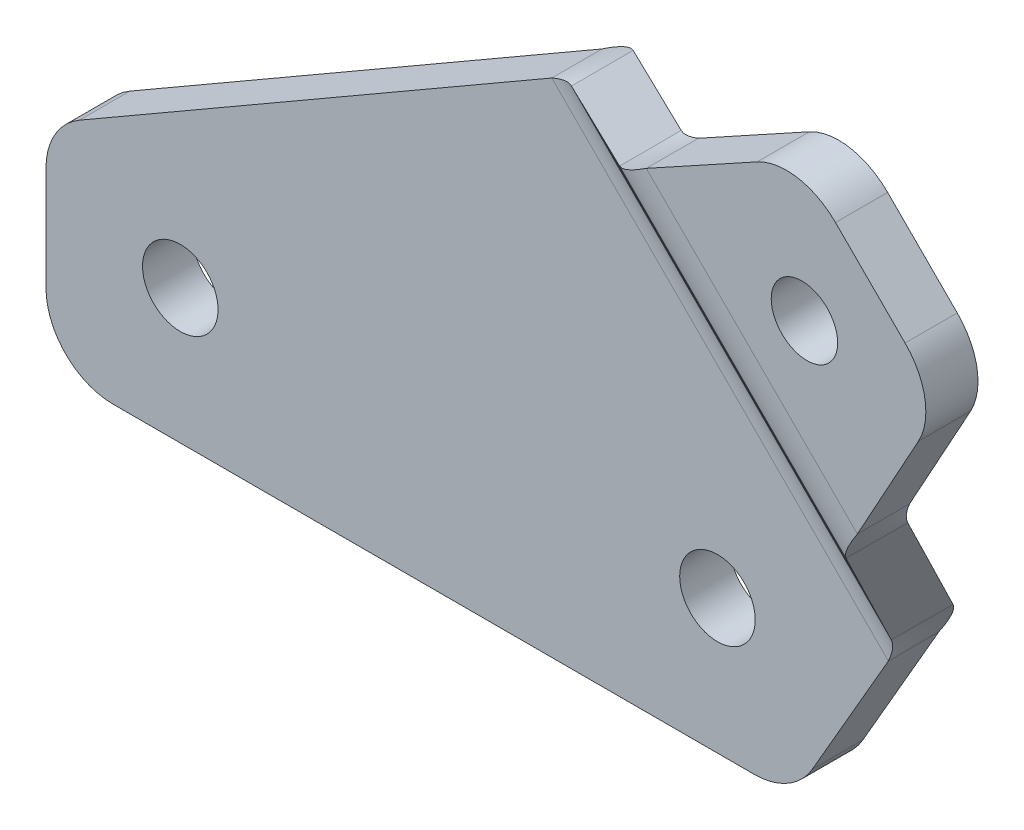
ISO-10303-21;
HEADER;
FILE_DESCRIPTION(('STEP AP214'),'2;1');
FILE_NAME('part.step','',(''),(''),'','','');
FILE_SCHEMA(('AUTOMOTIVE_DESIGN { 1 0 10303 214 1 1 1 1 }'));
ENDSEC;
DATA;
#1=APPLICATION_CONTEXT('core data for automotive mechanical design processes');
#2=APPLICATION_PROTOCOL_DEFINITION('international standard','automotive_design',2000,#1);
#3=PRODUCT_CONTEXT('',#1,'mechanical');
#4=PRODUCT('Part','Part','',(#3));
#5=PRODUCT_RELATED_PRODUCT_CATEGORY('part','',(#4));
#6=PRODUCT_DEFINITION_FORMATION('','',#4);
#7=PRODUCT_DEFINITION_CONTEXT('part definition',#1,'design');
#8=PRODUCT_DEFINITION('design','',#6,#7);
#9=PRODUCT_DEFINITION_SHAPE('','',#8);
#10=(LENGTH_UNIT() NAMED_UNIT(*) SI_UNIT(.MILLI.,.METRE.));
#11=(NAMED_UNIT(*) PLANE_ANGLE_UNIT() SI_UNIT($,.RADIAN.));
#12=(NAMED_UNIT(*) SI_UNIT($,.STERADIAN.) SOLID_ANGLE_UNIT());
#13=UNCERTAINTY_MEASURE_WITH_UNIT(LENGTH_MEASURE(1.E-05),#10,'distance_accuracy_value','');
#14=(GEOMETRIC_REPRESENTATION_CONTEXT(3) GLOBAL_UNCERTAINTY_ASSIGNED_CONTEXT((#13)) GLOBAL_UNIT_ASSIGNED_CONTEXT((#10,
#11,#12)) REPRESENTATION_CONTEXT('',''));
#15=CARTESIAN_POINT('',(0.,0.,0.));
#16=DIRECTION('',(0.,0.,1.));
#17=DIRECTION('',(1.,0.,0.));
#18=AXIS2_PLACEMENT_3D('',#15,#16,#17);
#19=CARTESIAN_POINT('',(-64.29375,16.1775757906459,4.7625));
#20=DIRECTION('',(0.,0.,1.));
#21=DIRECTION('',(1.,0.,0.));
#22=AXIS2_PLACEMENT_3D('',#19,#20,#21);
#23=CYLINDRICAL_SURFACE('',#22,6.35);
#24=DIRECTION('',(0.,0.,1.));
#25=VECTOR('',#24,1.);
#26=CARTESIAN_POINT('',(-67.46875,21.676837104677,4.7625));
#27=LINE('',#26,#25);
#28=CARTESIAN_POINT('',(-67.46875,21.676837104677,0.));
#29=VERTEX_POINT('',#28);
#30=CARTESIAN_POINT('',(-67.46875,21.676837104677,4.7625));
#31=VERTEX_POINT('',#30);
#32=EDGE_CURVE('E425',#29,#31,#27,.T.);
#33=ORIENTED_EDGE('',*,*,#32,.F.);
#34=CARTESIAN_POINT('',(-64.29375,16.1775757906459,0.));
#35=DIRECTION('',(0.,0.,-1.));
#36=DIRECTION('',(-1.,0.,0.));
#37=AXIS2_PLACEMENT_3D('',#34,#35,#36);
#38=CIRCLE('',#37,6.35);
#39=CARTESIAN_POINT('',(-70.64375,16.1775757906459,0.));
#40=VERTEX_POINT('',#39);
#41=EDGE_CURVE('E246',#40,#29,#38,.T.);
#42=ORIENTED_EDGE('',*,*,#41,.F.);
#43=DIRECTION('',(0.,0.,1.));
#44=VECTOR('',#43,1.);
#45=CARTESIAN_POINT('',(-70.64375,16.1775757906459,4.7625));
#46=LINE('',#45,#44);
#47=CARTESIAN_POINT('',(-70.64375,16.1775757906459,4.7625));
#48=VERTEX_POINT('',#47);
#49=EDGE_CURVE('E421',#40,#48,#46,.T.);
#50=ORIENTED_EDGE('',*,*,#49,.T.);
#51=CARTESIAN_POINT('',(-64.29375,16.1775757906459,4.7625));
#52=DIRECTION('',(0.,0.,-1.));
#53=DIRECTION('',(-0.866025403784439,0.5,0.));
#54=AXIS2_PLACEMENT_3D('',#51,#52,#53);
#55=CIRCLE('',#54,6.35);
#56=EDGE_CURVE('E194',#48,#31,#55,.T.);
#57=ORIENTED_EDGE('',*,*,#56,.T.);
#58=EDGE_LOOP('',(#33,#42,#50,#57));
#59=FACE_BOUND('',#58,.T.);
#60=ADVANCED_FACE('F50',(#59),#23,.T.);
#61=CARTESIAN_POINT('',(-70.64375,19.84375,4.7625));
#62=DIRECTION('',(1.,0.,0.));
#63=DIRECTION('',(0.,1.,0.));
#64=AXIS2_PLACEMENT_3D('',#61,#62,#63);
#65=PLANE('',#64);
#66=ORIENTED_EDGE('',*,*,#49,.F.);
#67=DIRECTION('',(0.,1.,0.));
#68=VECTOR('',#67,1.);
#69=CARTESIAN_POINT('',(-70.64375,36.272010063895,0.));
#70=LINE('',#69,#68);
#71=CARTESIAN_POINT('',(-70.64375,6.35,0.));
#72=VERTEX_POINT('',#71);
#73=EDGE_CURVE('E242',#72,#40,#70,.T.);
#74=ORIENTED_EDGE('',*,*,#73,.F.);
#75=DIRECTION('',(0.,0.,1.));
#76=VECTOR('',#75,1.);
#77=CARTESIAN_POINT('',(-70.64375,6.35,4.7625));
#78=LINE('',#77,#76);
#79=CARTESIAN_POINT('',(-70.64375,6.35,4.7625));
#80=VERTEX_POINT('',#79);
#81=EDGE_CURVE('E417',#72,#80,#78,.T.);
#82=ORIENTED_EDGE('',*,*,#81,.T.);
#83=DIRECTION('',(0.,1.,0.));
#84=VECTOR('',#83,1.);
#85=CARTESIAN_POINT('',(-70.64375,19.84375,4.7625));
#86=LINE('',#85,#84);
#87=EDGE_CURVE('E198',#80,#48,#86,.T.);
#88=ORIENTED_EDGE('',*,*,#87,.T.);
#89=EDGE_LOOP('',(#66,#74,#82,#88));
#90=FACE_BOUND('',#89,.T.);
#91=ADVANCED_FACE('F726',(#90),#65,.F.);
#92=CARTESIAN_POINT('',(-64.29375,6.35,4.7625));
#93=DIRECTION('',(0.,0.,1.));
#94=DIRECTION('',(1.,0.,0.));
#95=AXIS2_PLACEMENT_3D('',#92,#93,#94);
#96=CYLINDRICAL_SURFACE('',#95,6.35);
#97=ORIENTED_EDGE('',*,*,#81,.F.);
#98=CARTESIAN_POINT('',(-64.29375,6.35,0.));
#99=DIRECTION('',(0.,0.,-1.));
#100=DIRECTION('',(-1.,0.,0.));
#101=AXIS2_PLACEMENT_3D('',#98,#99,#100);
#102=CIRCLE('',#101,6.35);
#103=CARTESIAN_POINT('',(-64.29375,0.,0.));
#104=VERTEX_POINT('',#103);
#105=EDGE_CURVE('E238',#104,#72,#102,.T.);
#106=ORIENTED_EDGE('',*,*,#105,.F.);
#107=DIRECTION('',(0.,0.,1.));
#108=VECTOR('',#107,1.);
#109=CARTESIAN_POINT('',(-64.29375,0.,4.7625));
#110=LINE('',#109,#108);
#111=CARTESIAN_POINT('',(-64.29375,0.,4.7625));
#112=VERTEX_POINT('',#111);
#113=EDGE_CURVE('E413',#104,#112,#110,.T.);
#114=ORIENTED_EDGE('',*,*,#113,.T.);
#115=CARTESIAN_POINT('',(-64.29375,6.35,4.7625));
#116=DIRECTION('',(0.,0.,-1.));
#117=DIRECTION('',(-0.707106781186547,-0.707106781186548,0.));
#118=AXIS2_PLACEMENT_3D('',#115,#116,#117);
#119=CIRCLE('',#118,6.35);
#120=EDGE_CURVE('E202',#112,#80,#119,.T.);
#121=ORIENTED_EDGE('',*,*,#120,.T.);
#122=EDGE_LOOP('',(#97,#106,#114,#121));
#123=FACE_BOUND('',#122,.T.);
#124=ADVANCED_FACE('F732',(#123),#96,.T.);
#125=CARTESIAN_POINT('',(-70.64375,0.,4.7625));
#126=DIRECTION('',(0.,1.,0.));
#127=DIRECTION('',(-1.,0.,0.));
#128=AXIS2_PLACEMENT_3D('',#125,#126,#127);
#129=PLANE('',#128);
#130=ORIENTED_EDGE('',*,*,#113,.F.);
#131=DIRECTION('',(1.,0.,0.));
#132=VECTOR('',#131,1.);
#133=CARTESIAN_POINT('',(-18.2687851922297,0.,0.));
#134=LINE('',#133,#132);
#135=CARTESIAN_POINT('',(-3.66617420935411,0.,0.));
#136=VERTEX_POINT('',#135);
#137=EDGE_CURVE('E234',#136,#104,#134,.F.);
#138=ORIENTED_EDGE('',*,*,#137,.F.);
#139=DIRECTION('',(0.,0.,1.));
#140=VECTOR('',#139,1.);
#141=CARTESIAN_POINT('',(-3.66617420935411,0.,4.7625));
#142=LINE('',#141,#140);
#143=CARTESIAN_POINT('',(-3.66617420935411,0.,4.7625));
#144=VERTEX_POINT('',#143);
#145=EDGE_CURVE('E409',#136,#144,#142,.T.);
#146=ORIENTED_EDGE('',*,*,#145,.T.);
#147=DIRECTION('',(-1.,0.,0.));
#148=VECTOR('',#147,1.);
#149=CARTESIAN_POINT('',(-70.64375,0.,4.7625));
#150=LINE('',#149,#148);
#151=EDGE_CURVE('E206',#144,#112,#150,.T.);
#152=ORIENTED_EDGE('',*,*,#151,.T.);
#153=EDGE_LOOP('',(#130,#138,#146,#152));
#154=FACE_BOUND('',#153,.T.);
#155=ADVANCED_FACE('F1029',(#154),#129,.F.);
#156=CARTESIAN_POINT('',(-3.66617420935414,6.35,4.7625));
#157=DIRECTION('',(0.,0.,1.));
#158=DIRECTION('',(1.,0.,0.));
#159=AXIS2_PLACEMENT_3D('',#156,#157,#158);
#160=CYLINDRICAL_SURFACE('',#159,6.35);
#161=ORIENTED_EDGE('',*,*,#145,.F.);
#162=CARTESIAN_POINT('',(-3.66617420935414,6.35,0.));
#163=DIRECTION('',(0.,0.,-1.));
#164=DIRECTION('',(-1.,0.,0.));
#165=AXIS2_PLACEMENT_3D('',#162,#163,#164);
#166=CIRCLE('',#165,6.35);
#167=CARTESIAN_POINT('',(1.83308710467706,3.175,0.));
#168=VERTEX_POINT('',#167);
#169=EDGE_CURVE('E229',#168,#136,#166,.T.);
#170=ORIENTED_EDGE('',*,*,#169,.F.);
#171=DIRECTION('',(0.,0.,1.));
#172=VECTOR('',#171,1.);
#173=CARTESIAN_POINT('',(1.83308710467706,3.175,4.7625));
#174=LINE('',#173,#172);
#175=CARTESIAN_POINT('',(1.83308710467706,3.175,4.7625));
#176=VERTEX_POINT('',#175);
#177=EDGE_CURVE('E401',#168,#176,#174,.T.);
#178=ORIENTED_EDGE('',*,*,#177,.T.);
#179=CARTESIAN_POINT('',(-3.66617420935414,6.35,4.7625));
#180=DIRECTION('',(0.,0.,-1.));
#181=DIRECTION('',(0.5,-0.866025403784439,0.));
#182=AXIS2_PLACEMENT_3D('',#179,#180,#181);
#183=CIRCLE('',#182,6.35);
#184=EDGE_CURVE('E210',#176,#144,#183,.T.);
#185=ORIENTED_EDGE('',*,*,#184,.T.);
#186=EDGE_LOOP('',(#161,#170,#178,#185));
#187=FACE_BOUND('',#186,.T.);
#188=ADVANCED_FACE('F1018',(#187),#160,.T.);
#189=CARTESIAN_POINT('',(0.,0.,4.7625));
#190=DIRECTION('',(-0.866025403784439,0.5,0.));
#191=DIRECTION('',(-0.5,-0.866025403784439,0.));
#192=AXIS2_PLACEMENT_3D('',#189,#190,#191);
#193=PLANE('',#192);
#194=ORIENTED_EDGE('',*,*,#177,.F.);
#195=DIRECTION('',(-0.5,-0.866025403784439,0.));
#196=VECTOR('',#195,1.);
#197=CARTESIAN_POINT('',(0.,0.,0.));
#198=LINE('',#197,#196);
#199=CARTESIAN_POINT('',(9.02155589780456,15.6257931783202,0.));
#200=VERTEX_POINT('',#199);
#201=EDGE_CURVE('E233',#200,#168,#198,.T.);
#202=ORIENTED_EDGE('',*,*,#201,.F.);
#203=CARTESIAN_POINT('',(9.02155589780457,15.6257931783201,4.7625));
#204=CARTESIAN_POINT('',(9.02155589780453,15.6257931783201,0.));
#205=B_SPLINE_CURVE_WITH_KNOTS('',1,(#203,#204),.UNSPECIFIED.,.F.,.F.,(2,2),(0.,1.),.UNSPECIFIED.);
#206=CARTESIAN_POINT('',(9.02155589780457,15.6257931783202,4.7625));
#207=VERTEX_POINT('',#206);
#208=EDGE_CURVE('E73',#200,#207,#205,.F.);
#209=ORIENTED_EDGE('',*,*,#208,.T.);
#210=DIRECTION('',(-0.5,-0.866025403784439,0.));
#211=VECTOR('',#210,1.);
#212=CARTESIAN_POINT('',(0.,0.,4.7625));
#213=LINE('',#212,#211);
#214=EDGE_CURVE('E214',#207,#176,#213,.T.);
#215=ORIENTED_EDGE('',*,*,#214,.T.);
#216=EDGE_LOOP('',(#194,#202,#209,#215));
#217=FACE_BOUND('',#216,.T.);
#218=ADVANCED_FACE('F348',(#217),#193,.F.);
#219=CARTESIAN_POINT('',(9.02155589780453,15.6257931783201,0.));
#220=CARTESIAN_POINT('',(10.1314115742364,17.2662497758951,0.));
#221=CARTESIAN_POINT('',(11.2297980726473,18.8909220369658,0.607105710027414));
#222=CARTESIAN_POINT('',(12.0909595729148,20.2826844583737,1.72257677814734));
#223=CARTESIAN_POINT('',(9.02155589780457,15.6257931783201,4.7625));
#224=CARTESIAN_POINT('',(9.44376115154303,16.5785084385995,4.7625));
#225=CARTESIAN_POINT('',(9.86150636249929,17.52272124142,5.0661484189342));
#226=CARTESIAN_POINT('',(10.1593858341239,18.3511107195828,5.62378838907368));
#227=B_SPLINE_SURFACE_WITH_KNOTS('',1,3,((#219,#220,#221,#222),(#223,#224,#225,#226)),
.UNSPECIFIED.,.F.,.F.,.F.,(2,2),(4,4),(0.,1.),(0.,0.312434429609136),.UNSPECIFIED.);
#228=CARTESIAN_POINT('',(9.02155589780453,15.6257931783201,0.));
#229=CARTESIAN_POINT('',(10.1314115742364,17.2662497758951,0.));
#230=CARTESIAN_POINT('',(11.2297980726473,18.8909220369658,0.607105710027414));
#231=CARTESIAN_POINT('',(12.0909595729148,20.2826844583737,1.72257677814734));
#232=B_SPLINE_CURVE_WITH_KNOTS('',3,(#228,#229,#230,#231),.UNSPECIFIED.,.F.,.F.,(4,4),(0.,
0.312434429609136),.UNSPECIFIED.);
#233=CARTESIAN_POINT('',(12.0909595729148,20.2826844583737,1.72257677814737));
#234=VERTEX_POINT('',#233);
#235=EDGE_CURVE('E310',#200,#234,#232,.T.);
#236=CARTESIAN_POINT('',(12.0909595729148,20.2826844583737,1.72257677814734));
#237=CARTESIAN_POINT('',(10.1593858341239,18.3511107195828,5.62378838907368));
#238=B_SPLINE_CURVE_WITH_KNOTS('',1,(#236,#237),.UNSPECIFIED.,.F.,.F.,(2,2),(0.,1.),.UNSPECIFIED.);
#239=CARTESIAN_POINT('',(10.1593858341239,18.3511107195828,5.62378838907368));
#240=VERTEX_POINT('',#239);
#241=EDGE_CURVE('E380',#234,#240,#238,.T.);
#242=CARTESIAN_POINT('',(10.1593858341239,18.3511107195828,5.62378838907368));
#243=CARTESIAN_POINT('',(9.86150636249929,17.52272124142,5.0661484189342));
#244=CARTESIAN_POINT('',(9.44376115154303,16.5785084385995,4.7625));
#245=CARTESIAN_POINT('',(9.02155589780457,15.6257931783201,4.7625));
#246=B_SPLINE_CURVE_WITH_KNOTS('',3,(#242,#243,#244,#245),.UNSPECIFIED.,.F.,.F.,(4,4),(0.,
0.312434429609136),.UNSPECIFIED.);
#247=EDGE_CURVE('E329',#207,#240,#246,.F.);
#248=ORIENTED_EDGE('',*,*,#208,.F.);
#249=ORIENTED_EDGE('',*,*,#235,.T.);
#250=ORIENTED_EDGE('',*,*,#241,.T.);
#251=ORIENTED_EDGE('',*,*,#247,.F.);
#252=EDGE_LOOP('',(#248,#249,#250,#251));
#253=FACE_BOUND('',#252,.T.);
#254=ADVANCED_FACE('F335',(#253),#227,.F.);
#255=CARTESIAN_POINT('',(1.73371737524114,1.73371737524114,-6.77556989811773));
#256=DIRECTION('',(-0.832927930778083,0.533097473006356,-0.148452505549684));
#257=DIRECTION('',(-0.37647854913814,-0.742503952922578,-0.554032293222323));
#258=AXIS2_PLACEMENT_3D('',#255,#256,#257);
#259=PLANE('',#258);
#260=ORIENTED_EDGE('',*,*,#241,.F.);
#261=DIRECTION('',(-0.37647854913814,-0.742503952922578,-0.554032293222323));
#262=VECTOR('',#261,1.);
#263=CARTESIAN_POINT('',(3.66529111403209,3.66529111403209,-10.6767815090441));
#264=LINE('',#263,#262);
#265=CARTESIAN_POINT('',(21.1744331875424,38.1974237723901,15.0899724203623));
#266=VERTEX_POINT('',#265);
#267=EDGE_CURVE('E625',#266,#234,#264,.T.);
#268=ORIENTED_EDGE('',*,*,#267,.F.);
#269=CARTESIAN_POINT('',(19.2428594487514,36.2658500335991,18.9911840312886));
#270=CARTESIAN_POINT('',(21.1744331875423,38.19742377239,15.0899724203623));
#271=B_SPLINE_CURVE_WITH_KNOTS('',1,(#269,#270),.UNSPECIFIED.,.F.,.F.,(2,2),(0.,1.),.UNSPECIFIED.);
#272=CARTESIAN_POINT('',(19.2428594487514,36.2658500335991,18.9911840312886));
#273=VERTEX_POINT('',#272);
#274=EDGE_CURVE('E695',#266,#273,#271,.F.);
#275=ORIENTED_EDGE('',*,*,#274,.T.);
#276=DIRECTION('',(-0.37647854913814,-0.742503952922578,-0.554032293222323));
#277=VECTOR('',#276,1.);
#278=CARTESIAN_POINT('',(1.73371737524114,1.73371737524114,-6.77556989811773));
#279=LINE('',#278,#277);
#280=EDGE_CURVE('E558',#273,#240,#279,.T.);
#281=ORIENTED_EDGE('',*,*,#280,.T.);
#282=EDGE_LOOP('',(#260,#268,#275,#281));
#283=FACE_BOUND('',#282,.T.);
#284=ADVANCED_FACE('F347',(#283),#259,.F.);
#285=CARTESIAN_POINT('',(19.2428594487514,36.2658500335991,18.9911840312886));
#286=CARTESIAN_POINT('',(20.0296652480122,37.5374431099451,20.0103415671022));
#287=CARTESIAN_POINT('',(21.0155005871481,39.0051211337194,20.6077141442693));
#288=CARTESIAN_POINT('',(22.0278055883786,40.5022134120317,20.7007071279732));
#289=CARTESIAN_POINT('',(21.1744331875423,38.19742377239,15.0899724203623));
#290=CARTESIAN_POINT('',(21.4466027269021,38.9543155108928,15.5994827823122));
#291=CARTESIAN_POINT('',(21.8191479428384,39.8088335673519,15.8982437185511));
#292=CARTESIAN_POINT('',(22.2040519476546,40.6784597713077,15.9447339687046));
#293=B_SPLINE_SURFACE_WITH_KNOTS('',1,3,((#285,#286,#287,#288),(#289,#290,#291,#292)),
.UNSPECIFIED.,.F.,.F.,.F.,(2,2),(4,4),(0.,1.),(0.,0.542664557272831),.UNSPECIFIED.);
#294=CARTESIAN_POINT('',(21.1744331875423,38.19742377239,15.0899724203623));
#295=CARTESIAN_POINT('',(21.4466027269021,38.9543155108928,15.5994827823122));
#296=CARTESIAN_POINT('',(21.8191479428384,39.8088335673519,15.8982437185511));
#297=CARTESIAN_POINT('',(22.2040519476546,40.6784597713077,15.9447339687046));
#298=B_SPLINE_CURVE_WITH_KNOTS('',3,(#294,#295,#296,#297),.UNSPECIFIED.,.F.,.F.,(4,4),(0.,
0.542664557272831),.UNSPECIFIED.);
#299=CARTESIAN_POINT('',(22.2040519476547,40.6784597713077,15.9447339687046));
#300=VERTEX_POINT('',#299);
#301=EDGE_CURVE('E254',#266,#300,#298,.T.);
#302=CARTESIAN_POINT('',(22.2040519476546,40.6784597713077,15.9447339687046));
#303=CARTESIAN_POINT('',(22.0278055883786,40.5022134120317,20.7007071279732));
#304=B_SPLINE_CURVE_WITH_KNOTS('',1,(#302,#303),.UNSPECIFIED.,.F.,.F.,(2,2),(0.,1.),.UNSPECIFIED.);
#305=CARTESIAN_POINT('',(22.0278055883786,40.5022134120317,20.7007071279732));
#306=VERTEX_POINT('',#305);
#307=EDGE_CURVE('E684',#300,#306,#304,.T.);
#308=CARTESIAN_POINT('',(22.0278055883786,40.5022134120317,20.7007071279732));
#309=CARTESIAN_POINT('',(21.0155005871481,39.0051211337194,20.6077141442693));
#310=CARTESIAN_POINT('',(20.0296652480122,37.5374431099451,20.0103415671022));
#311=CARTESIAN_POINT('',(19.2428594487514,36.2658500335991,18.9911840312886));
#312=B_SPLINE_CURVE_WITH_KNOTS('',3,(#308,#309,#310,#311),.UNSPECIFIED.,.F.,.F.,(4,4),(0.,
0.542664557272831),.UNSPECIFIED.);
#313=EDGE_CURVE('E190',#273,#306,#312,.F.);
#314=ORIENTED_EDGE('',*,*,#274,.F.);
#315=ORIENTED_EDGE('',*,*,#301,.T.);
#316=ORIENTED_EDGE('',*,*,#307,.T.);
#317=ORIENTED_EDGE('',*,*,#313,.F.);
#318=EDGE_LOOP('',(#314,#315,#316,#317));
#319=FACE_BOUND('',#318,.T.);
#320=ADVANCED_FACE('F646',(#319),#293,.T.);
#321=CARTESIAN_POINT('',(-3.16145979125076,-3.16145979125076,18.149162082551));
#322=DIRECTION('',(-0.865774591237024,0.500250812547415,-0.0135455422193261));
#323=DIRECTION('',(-0.499063954829872,-0.865089358614311,-0.0505526517785941));
#324=AXIS2_PLACEMENT_3D('',#321,#322,#323);
#325=PLANE('',#324);
#326=ORIENTED_EDGE('',*,*,#307,.F.);
#327=DIRECTION('',(-0.499063954829872,-0.865089358614311,-0.0505526517785941));
#328=VECTOR('',#327,1.);
#329=CARTESIAN_POINT('',(-2.98521343197474,-2.98521343197474,13.3931889232823));
#330=LINE('',#329,#328);
#331=CARTESIAN_POINT('',(28.6254140521099,51.8094019493842,16.5951854374376));
#332=VERTEX_POINT('',#331);
#333=EDGE_CURVE('E228',#332,#300,#330,.T.);
#334=ORIENTED_EDGE('',*,*,#333,.F.);
#335=DIRECTION('',(-0.0370071095592681,-0.0370071095592681,0.998629534754574));
#336=VECTOR('',#335,1.);
#337=CARTESIAN_POINT('',(28.4491676928338,51.6331555901081,21.3511585967062));
#338=LINE('',#337,#336);
#339=CARTESIAN_POINT('',(28.4491676928338,51.6331555901081,21.3511585967062));
#340=VERTEX_POINT('',#339);
#341=EDGE_CURVE('E1371',#332,#340,#338,.T.);
#342=ORIENTED_EDGE('',*,*,#341,.T.);
#343=DIRECTION('',(-0.499063954829872,-0.865089358614311,-0.0505526517785941));
#344=VECTOR('',#343,1.);
#345=CARTESIAN_POINT('',(-3.16145979125076,-3.16145979125076,18.149162082551));
#346=LINE('',#345,#344);
#347=EDGE_CURVE('E540',#340,#306,#346,.T.);
#348=ORIENTED_EDGE('',*,*,#347,.T.);
#349=EDGE_LOOP('',(#326,#334,#342,#348));
#350=FACE_BOUND('',#349,.T.);
#351=ADVANCED_FACE('F657',(#350),#325,.F.);
#352=CARTESIAN_POINT('',(22.9514990384788,54.8097482497841,21.2651444036136));
#353=DIRECTION('',(-0.0370071095592681,-0.0370071095592681,0.998629534754574));
#354=DIRECTION('',(0.999314062578908,0.,0.0370324767202721));
#355=AXIS2_PLACEMENT_3D('',#352,#353,#354);
#356=CYLINDRICAL_SURFACE('',#355,6.35);
#357=ORIENTED_EDGE('',*,*,#341,.F.);
#358=CARTESIAN_POINT('',(23.1277453977548,54.9859946090601,16.5091712443449));
#359=DIRECTION('',(0.037007109559268,0.0370071095592681,-0.998629534754574));
#360=DIRECTION('',(0.,0.999314062578908,0.0370324767202721));
#361=AXIS2_PLACEMENT_3D('',#358,#359,#360);
#362=CIRCLE('',#361,6.35);
#363=CARTESIAN_POINT('',(27.611719893835,59.4699691051403,16.8415045664876));
#364=VERTEX_POINT('',#363);
#365=EDGE_CURVE('E224',#364,#332,#362,.T.);
#366=ORIENTED_EDGE('',*,*,#365,.F.);
#367=DIRECTION('',(-0.0370071095592681,-0.0370071095592681,0.998629534754574));
#368=VECTOR('',#367,1.);
#369=CARTESIAN_POINT('',(27.4354735345589,59.2937227458642,21.5974777257562));
#370=LINE('',#369,#368);
#371=CARTESIAN_POINT('',(27.4354735345589,59.2937227458642,21.5974777257562));
#372=VERTEX_POINT('',#371);
#373=EDGE_CURVE('E1364',#364,#372,#370,.T.);
#374=ORIENTED_EDGE('',*,*,#373,.T.);
#375=CARTESIAN_POINT('',(22.9514990384788,54.8097482497841,21.2651444036136));
#376=DIRECTION('',(0.037007109559268,0.0370071095592681,-0.998629534754574));
#377=DIRECTION('',(0.990676050206148,0.129757381052389,0.0415209057026754));
#378=AXIS2_PLACEMENT_3D('',#375,#376,#377);
#379=CIRCLE('',#378,6.35);
#380=EDGE_CURVE('E544',#372,#340,#379,.T.);
#381=ORIENTED_EDGE('',*,*,#380,.T.);
#382=EDGE_LOOP('',(#357,#366,#374,#381));
#383=FACE_BOUND('',#382,.T.);
#384=ADVANCED_FACE('F961',(#383),#356,.T.);
#385=CARTESIAN_POINT('',(30.8808699748886,55.8483263055345,21.5974777257562));
#386=DIRECTION('',(-0.706137715918126,-0.706137715918127,-0.052335956242944));
#387=DIRECTION('',(0.707106781186548,-0.707106781186547,0.));
#388=AXIS2_PLACEMENT_3D('',#385,#386,#387);
#389=PLANE('',#388);
#390=ORIENTED_EDGE('',*,*,#373,.F.);
#391=DIRECTION('',(-0.707106781186548,0.707106781186548,0.));
#392=VECTOR('',#391,1.);
#393=CARTESIAN_POINT('',(16.2704468714253,70.81124212755,16.8415045664876));
#394=LINE('',#393,#392);
#395=CARTESIAN_POINT('',(21.0321285928908,66.0495604060845,16.8415045664876));
#396=VERTEX_POINT('',#395);
#397=EDGE_CURVE('E220',#396,#364,#394,.F.);
#398=ORIENTED_EDGE('',*,*,#397,.F.);
#399=DIRECTION('',(-0.0370071095592681,-0.0370071095592681,0.998629534754574));
#400=VECTOR('',#399,1.);
#401=CARTESIAN_POINT('',(20.8558822336148,65.8733140468084,21.5974777257562));
#402=LINE('',#401,#400);
#403=CARTESIAN_POINT('',(20.8558822336148,65.8733140468084,21.5974777257562));
#404=VERTEX_POINT('',#403);
#405=EDGE_CURVE('E1358',#396,#404,#402,.T.);
#406=ORIENTED_EDGE('',*,*,#405,.T.);
#407=DIRECTION('',(0.707106781186548,-0.707106781186547,0.));
#408=VECTOR('',#407,1.);
#409=CARTESIAN_POINT('',(30.8808699748886,55.8483263055345,21.5974777257562));
#410=LINE('',#409,#408);
#411=EDGE_CURVE('E1186',#404,#372,#410,.T.);
#412=ORIENTED_EDGE('',*,*,#411,.T.);
#413=EDGE_LOOP('',(#390,#398,#406,#412));
#414=FACE_BOUND('',#413,.T.);
#415=ADVANCED_FACE('F949',(#414),#389,.F.);
#416=CARTESIAN_POINT('',(16.3719077375347,61.3893395507284,21.2651444036135));
#417=DIRECTION('',(-0.0370071095592681,-0.0370071095592681,0.998629534754574));
#418=DIRECTION('',(0.999314062578908,0.,0.0370324767202721));
#419=AXIS2_PLACEMENT_3D('',#416,#417,#418);
#420=CYLINDRICAL_SURFACE('',#419,6.35);
#421=ORIENTED_EDGE('',*,*,#405,.F.);
#422=CARTESIAN_POINT('',(16.5481540968107,61.5655859100044,16.5091712443448));
#423=DIRECTION('',(0.0370071095592681,0.0370071095592681,-0.998629534754574));
#424=DIRECTION('',(-0.999314062578908,0.,-0.0370324767202721));
#425=AXIS2_PLACEMENT_3D('',#422,#423,#424);
#426=CIRCLE('',#425,6.35);
#427=CARTESIAN_POINT('',(13.3715614371347,67.0632545643594,16.5951854374376));
#428=VERTEX_POINT('',#427);
#429=EDGE_CURVE('E215',#428,#396,#426,.T.);
#430=ORIENTED_EDGE('',*,*,#429,.F.);
#431=DIRECTION('',(-0.0370071095592681,-0.0370071095592681,0.998629534754574));
#432=VECTOR('',#431,1.);
#433=CARTESIAN_POINT('',(13.1953150778586,66.8870082050833,21.3511585967062));
#434=LINE('',#433,#432);
#435=CARTESIAN_POINT('',(13.1953150778586,66.8870082050833,21.3511585967062));
#436=VERTEX_POINT('',#435);
#437=EDGE_CURVE('E1353',#428,#436,#434,.T.);
#438=ORIENTED_EDGE('',*,*,#437,.T.);
#439=CARTESIAN_POINT('',(16.3719077375347,61.3893395507284,21.2651444036135));
#440=DIRECTION('',(0.0370071095592681,0.0370071095592681,-0.998629534754574));
#441=DIRECTION('',(0.129757381052389,0.990676050206148,0.0415209057026755));
#442=AXIS2_PLACEMENT_3D('',#439,#440,#441);
#443=CIRCLE('',#442,6.35);
#444=EDGE_CURVE('E588',#436,#404,#443,.T.);
#445=ORIENTED_EDGE('',*,*,#444,.T.);
#446=EDGE_LOOP('',(#421,#430,#438,#445));
#447=FACE_BOUND('',#446,.T.);
#448=ADVANCED_FACE('F937',(#447),#420,.T.);
#449=CARTESIAN_POINT('',(17.4104857932849,69.3187104871382,21.5974777257562));
#450=DIRECTION('',(0.500250812547415,-0.865774591237024,-0.0135455422193261));
#451=DIRECTION('',(0.865089358614311,0.499063954829872,0.0505526517785941));
#452=AXIS2_PLACEMENT_3D('',#449,#450,#451);
#453=PLANE('',#452);
#454=ORIENTED_EDGE('',*,*,#437,.F.);
#455=DIRECTION('',(0.865089358614311,0.499063954829872,0.0505526517785941));
#456=VECTOR('',#455,1.);
#457=CARTESIAN_POINT('',(17.586732152561,69.4949568464142,16.8415045664875));
#458=LINE('',#457,#456);
#459=CARTESIAN_POINT('',(2.2406192590582,60.641892459904,15.9447339687046));
#460=VERTEX_POINT('',#459);
#461=EDGE_CURVE('E219',#460,#428,#458,.T.);
#462=ORIENTED_EDGE('',*,*,#461,.F.);
#463=CARTESIAN_POINT('',(2.06437289978216,60.465646100628,20.7007071279732));
#464=CARTESIAN_POINT('',(2.2406192590582,60.641892459904,15.9447339687046));
#465=B_SPLINE_CURVE_WITH_KNOTS('',1,(#463,#464),.UNSPECIFIED.,.F.,.F.,(2,2),(0.,1.),.UNSPECIFIED.);
#466=CARTESIAN_POINT('',(2.06437289978215,60.465646100628,20.7007071279732));
#467=VERTEX_POINT('',#466);
#468=EDGE_CURVE('E1349',#460,#467,#465,.F.);
#469=ORIENTED_EDGE('',*,*,#468,.T.);
#470=DIRECTION('',(0.865089358614311,0.499063954829872,0.0505526517785941));
#471=VECTOR('',#470,1.);
#472=CARTESIAN_POINT('',(17.4104857932849,69.3187104871382,21.5974777257562));
#473=LINE('',#472,#471);
#474=EDGE_CURVE('E578',#467,#436,#473,.T.);
#475=ORIENTED_EDGE('',*,*,#474,.T.);
#476=EDGE_LOOP('',(#454,#462,#469,#475));
#477=FACE_BOUND('',#476,.T.);
#478=ADVANCED_FACE('F508',(#477),#453,.F.);
#479=CARTESIAN_POINT('',(2.06437289978216,60.465646100628,20.7007071279732));
#480=CARTESIAN_POINT('',(0.567280621458113,59.4533410993898,20.6077141442685));
#481=CARTESIAN_POINT('',(-0.900397402313864,58.4675057602555,20.0103415670943));
#482=CARTESIAN_POINT('',(-2.17199047865037,57.6806999610008,18.9911840312886));
#483=CARTESIAN_POINT('',(2.2406192590582,60.641892459904,15.9447339687046));
#484=CARTESIAN_POINT('',(1.3709930550955,60.256988455085,15.8982437185507));
#485=CARTESIAN_POINT('',(0.516474998637856,59.8844432391494,15.5994827823082));
#486=CARTESIAN_POINT('',(-0.240416739859402,59.6122736997918,15.0899724203622));
#487=B_SPLINE_SURFACE_WITH_KNOTS('',1,3,((#479,#480,#481,#482),(#483,#484,#485,#486)),
.UNSPECIFIED.,.F.,.F.,.F.,(2,2),(4,4),(0.,1.),(0.,0.542664557272817),.UNSPECIFIED.);
#488=CARTESIAN_POINT('',(2.2406192590582,60.641892459904,15.9447339687046));
#489=CARTESIAN_POINT('',(1.3709930550955,60.256988455085,15.8982437185507));
#490=CARTESIAN_POINT('',(0.516474998637856,59.8844432391494,15.5994827823082));
#491=CARTESIAN_POINT('',(-0.240416739859402,59.6122736997918,15.0899724203622));
#492=B_SPLINE_CURVE_WITH_KNOTS('',3,(#488,#489,#490,#491),.UNSPECIFIED.,.F.,.F.,(4,4),(0.,
0.542664557272817),.UNSPECIFIED.);
#493=CARTESIAN_POINT('',(-0.240416739859382,59.6122736997918,15.0899724203623));
#494=VERTEX_POINT('',#493);
#495=EDGE_CURVE('E601',#460,#494,#492,.T.);
#496=CARTESIAN_POINT('',(-0.240416739859402,59.6122736997918,15.0899724203622));
#497=CARTESIAN_POINT('',(-2.17199047865037,57.6806999610008,18.9911840312886));
#498=B_SPLINE_CURVE_WITH_KNOTS('',1,(#496,#497),.UNSPECIFIED.,.F.,.F.,(2,2),(0.,1.),.UNSPECIFIED.);
#499=CARTESIAN_POINT('',(-2.17199047865036,57.6806999610008,18.9911840312886));
#500=VERTEX_POINT('',#499);
#501=EDGE_CURVE('E491',#494,#500,#498,.T.);
#502=CARTESIAN_POINT('',(-2.17199047865037,57.6806999610008,18.9911840312886));
#503=CARTESIAN_POINT('',(-0.900397402313864,58.4675057602555,20.0103415670943));
#504=CARTESIAN_POINT('',(0.567280621458113,59.4533410993898,20.6077141442685));
#505=CARTESIAN_POINT('',(2.06437289978216,60.465646100628,20.7007071279732));
#506=B_SPLINE_CURVE_WITH_KNOTS('',3,(#502,#503,#504,#505),.UNSPECIFIED.,.F.,.F.,(4,4),(0.,
0.542664557272817),.UNSPECIFIED.);
#507=EDGE_CURVE('E587',#467,#500,#506,.F.);
#508=ORIENTED_EDGE('',*,*,#468,.F.);
#509=ORIENTED_EDGE('',*,*,#495,.T.);
#510=ORIENTED_EDGE('',*,*,#501,.T.);
#511=ORIENTED_EDGE('',*,*,#507,.F.);
#512=EDGE_LOOP('',(#508,#509,#510,#511));
#513=FACE_BOUND('',#512,.T.);
#514=ADVANCED_FACE('F497',(#513),#487,.T.);
#515=CARTESIAN_POINT('',(13.9438232302445,65.8520479240977,31.0162799127832));
#516=DIRECTION('',(0.533097473006356,-0.832927930778083,-0.148452505549684));
#517=DIRECTION('',(0.742503952922578,0.37647854913814,0.554032293222323));
#518=AXIS2_PLACEMENT_3D('',#515,#516,#517);
#519=PLANE('',#518);
#520=ORIENTED_EDGE('',*,*,#501,.F.);
#521=DIRECTION('',(0.742503952922578,0.37647854913814,0.554032293222323));
#522=VECTOR('',#521,1.);
#523=CARTESIAN_POINT('',(15.8753969690355,67.7836216628886,27.1150683018569));
#524=LINE('',#523,#522);
#525=CARTESIAN_POINT('',(-18.1551560538758,50.5288000851641,1.72257677814723));
#526=VERTEX_POINT('',#525);
#527=EDGE_CURVE('E718',#526,#494,#524,.T.);
#528=ORIENTED_EDGE('',*,*,#527,.F.);
#529=CARTESIAN_POINT('',(-20.0867297926667,48.5972263463732,5.62378838907368));
#530=CARTESIAN_POINT('',(-18.1551560538759,50.5288000851641,1.7225767781473));
#531=B_SPLINE_CURVE_WITH_KNOTS('',1,(#529,#530),.UNSPECIFIED.,.F.,.F.,(2,2),(0.,1.),.UNSPECIFIED.);
#532=CARTESIAN_POINT('',(-20.0867297926667,48.5972263463732,5.62378838907368));
#533=VERTEX_POINT('',#532);
#534=EDGE_CURVE('E1337',#526,#533,#531,.F.);
#535=ORIENTED_EDGE('',*,*,#534,.T.);
#536=DIRECTION('',(0.742503952922578,0.37647854913814,0.554032293222323));
#537=VECTOR('',#536,1.);
#538=CARTESIAN_POINT('',(13.9438232302445,65.8520479240977,31.0162799127832));
#539=LINE('',#538,#537);
#540=EDGE_CURVE('E270',#533,#500,#539,.T.);
#541=ORIENTED_EDGE('',*,*,#540,.T.);
#542=EDGE_LOOP('',(#520,#528,#535,#541));
#543=FACE_BOUND('',#542,.T.);
#544=ADVANCED_FACE('F452',(#543),#519,.F.);
#545=CARTESIAN_POINT('',(-18.1551560538759,50.5288000851641,1.7225767781473));
#546=CARTESIAN_POINT('',(-19.5469184752905,49.6676385848926,0.607105710022032));
#547=CARTESIAN_POINT('',(-21.1715907363619,48.5692520864813,0.));
#548=CARTESIAN_POINT('',(-22.8120473339294,47.4593964100538,0.));
#549=CARTESIAN_POINT('',(-20.0867297926667,48.5972263463732,5.62378838907368));
#550=CARTESIAN_POINT('',(-20.9151192708336,48.2993468747473,5.06614841893151));
#551=CARTESIAN_POINT('',(-21.8593320736545,47.8816016637909,4.7625));
#552=CARTESIAN_POINT('',(-22.8120473339293,47.4593964100539,4.7625));
#553=B_SPLINE_SURFACE_WITH_KNOTS('',1,3,((#545,#546,#547,#548),(#549,#550,#551,#552)),
.UNSPECIFIED.,.F.,.F.,.F.,(2,2),(4,4),(0.,1.),(0.,0.312434429609172),.UNSPECIFIED.);
#554=CARTESIAN_POINT('',(-18.1551560538759,50.5288000851641,1.7225767781473));
#555=CARTESIAN_POINT('',(-19.5469184752905,49.6676385848926,0.607105710022032));
#556=CARTESIAN_POINT('',(-21.1715907363619,48.5692520864813,0.));
#557=CARTESIAN_POINT('',(-22.8120473339294,47.4593964100538,0.));
#558=B_SPLINE_CURVE_WITH_KNOTS('',3,(#554,#555,#556,#557),.UNSPECIFIED.,.F.,.F.,(4,4),(0.,
0.312434429609172),.UNSPECIFIED.);
#559=CARTESIAN_POINT('',(-22.8120473339293,47.4593964100542,0.));
#560=VERTEX_POINT('',#559);
#561=EDGE_CURVE('E322',#526,#560,#558,.T.);
#562=CARTESIAN_POINT('',(-22.8120473339294,47.4593964100538,0.));
#563=CARTESIAN_POINT('',(-22.8120473339293,47.4593964100539,4.7625));
#564=B_SPLINE_CURVE_WITH_KNOTS('',1,(#562,#563),.UNSPECIFIED.,.F.,.F.,(2,2),(0.,1.),.UNSPECIFIED.);
#565=CARTESIAN_POINT('',(-22.8120473339293,47.4593964100542,4.7625));
#566=VERTEX_POINT('',#565);
#567=EDGE_CURVE('E433',#560,#566,#564,.T.);
#568=CARTESIAN_POINT('',(-22.8120473339293,47.4593964100539,4.7625));
#569=CARTESIAN_POINT('',(-21.8593320736545,47.8816016637909,4.7625));
#570=CARTESIAN_POINT('',(-20.9151192708336,48.2993468747473,5.06614841893151));
#571=CARTESIAN_POINT('',(-20.0867297926667,48.5972263463732,5.62378838907368));
#572=B_SPLINE_CURVE_WITH_KNOTS('',3,(#568,#569,#570,#571),.UNSPECIFIED.,.F.,.F.,(4,4),(0.,
0.312434429609172),.UNSPECIFIED.);
#573=EDGE_CURVE('E264',#533,#566,#572,.F.);
#574=ORIENTED_EDGE('',*,*,#534,.F.);
#575=ORIENTED_EDGE('',*,*,#561,.T.);
#576=ORIENTED_EDGE('',*,*,#567,.T.);
#577=ORIENTED_EDGE('',*,*,#573,.F.);
#578=EDGE_LOOP('',(#574,#575,#576,#577));
#579=FACE_BOUND('',#578,.T.);
#580=ADVANCED_FACE('F439',(#579),#553,.F.);
#581=CARTESIAN_POINT('',(-7.14375,12.7,4.7625));
#582=DIRECTION('',(0.,0.,1.));
#583=DIRECTION('',(1.,0.,0.));
#584=AXIS2_PLACEMENT_3D('',#581,#582,#583);
#585=CYLINDRICAL_SURFACE('',#584,3.571875);
#586=CARTESIAN_POINT('',(-7.14375,12.7,0.));
#587=DIRECTION('',(0.,0.,-1.));
#588=DIRECTION('',(-1.,0.,0.));
#589=AXIS2_PLACEMENT_3D('',#586,#587,#588);
#590=CIRCLE('',#589,3.571875);
#591=CARTESIAN_POINT('',(-10.715625,12.7,0.));
#592=VERTEX_POINT('',#591);
#593=EDGE_CURVE('E251',#592,#592,#590,.T.);
#594=ORIENTED_EDGE('',*,*,#593,.T.);
#595=DIRECTION('',(0.,0.,1.));
#596=VECTOR('',#595,1.);
#597=CARTESIAN_POINT('',(-10.715625,12.7,4.7625));
#598=LINE('',#597,#596);
#599=CARTESIAN_POINT('',(-10.715625,12.7,4.7625));
#600=VERTEX_POINT('',#599);
#601=EDGE_CURVE('E61',#592,#600,#598,.T.);
#602=ORIENTED_EDGE('',*,*,#601,.T.);
#603=CARTESIAN_POINT('',(-7.14375,12.7,4.7625));
#604=DIRECTION('',(0.,0.,-1.));
#605=DIRECTION('',(1.,0.,0.));
#606=AXIS2_PLACEMENT_3D('',#603,#604,#605);
#607=CIRCLE('',#606,3.571875);
#608=EDGE_CURVE('E180',#600,#600,#607,.T.);
#609=ORIENTED_EDGE('',*,*,#608,.F.);
#610=ORIENTED_EDGE('',*,*,#601,.F.);
#611=EDGE_LOOP('',(#594,#602,#609,#610));
#612=FACE_BOUND('',#611,.T.);
#613=ADVANCED_FACE('F451',(#612),#585,.F.);
#614=CARTESIAN_POINT('',(-57.94375,12.7,4.7625));
#615=DIRECTION('',(0.,0.,1.));
#616=DIRECTION('',(1.,0.,0.));
#617=AXIS2_PLACEMENT_3D('',#614,#615,#616);
#618=CYLINDRICAL_SURFACE('',#617,3.571875);
#619=CARTESIAN_POINT('',(-57.94375,12.7,0.));
#620=DIRECTION('',(0.,0.,-1.));
#621=DIRECTION('',(-1.,0.,0.));
#622=AXIS2_PLACEMENT_3D('',#619,#620,#621);
#623=CIRCLE('',#622,3.571875);
#624=CARTESIAN_POINT('',(-61.515625,12.7,0.));
#625=VERTEX_POINT('',#624);
#626=EDGE_CURVE('E167',#625,#625,#623,.T.);
#627=ORIENTED_EDGE('',*,*,#626,.T.);
#628=DIRECTION('',(0.,0.,1.));
#629=VECTOR('',#628,1.);
#630=CARTESIAN_POINT('',(-61.515625,12.7,4.7625));
#631=LINE('',#630,#629);
#632=CARTESIAN_POINT('',(-61.515625,12.7,4.7625));
#633=VERTEX_POINT('',#632);
#634=EDGE_CURVE('E11',#625,#633,#631,.T.);
#635=ORIENTED_EDGE('',*,*,#634,.T.);
#636=CARTESIAN_POINT('',(-57.94375,12.7,4.7625));
#637=DIRECTION('',(0.,0.,-1.));
#638=DIRECTION('',(1.,0.,0.));
#639=AXIS2_PLACEMENT_3D('',#636,#637,#638);
#640=CIRCLE('',#639,3.571875);
#641=EDGE_CURVE('E170',#633,#633,#640,.T.);
#642=ORIENTED_EDGE('',*,*,#641,.F.);
#643=ORIENTED_EDGE('',*,*,#634,.F.);
#644=EDGE_LOOP('',(#627,#635,#642,#643));
#645=FACE_BOUND('',#644,.T.);
#646=ADVANCED_FACE('F52',(#645),#618,.F.);
#647=CARTESIAN_POINT('',(20.635795433937,72.5440201277902,4.7625));
#648=DIRECTION('',(0.5,-0.866025403784438,0.));
#649=DIRECTION('',(0.866025403784438,0.5,0.));
#650=AXIS2_PLACEMENT_3D('',#647,#648,#649);
#651=PLANE('',#650);
#652=DIRECTION('',(0.866025403784438,0.5,0.));
#653=VECTOR('',#652,1.);
#654=CARTESIAN_POINT('',(20.635795433937,72.5440201277902,0.));
#655=LINE('',#654,#653);
#656=EDGE_CURVE('E250',#29,#560,#655,.T.);
#657=ORIENTED_EDGE('',*,*,#656,.F.);
#658=ORIENTED_EDGE('',*,*,#32,.T.);
#659=DIRECTION('',(0.866025403784438,0.5,0.));
#660=VECTOR('',#659,1.);
#661=CARTESIAN_POINT('',(20.635795433937,72.5440201277902,4.7625));
#662=LINE('',#661,#660);
#663=EDGE_CURVE('E187',#31,#566,#662,.T.);
#664=ORIENTED_EDGE('',*,*,#663,.T.);
#665=ORIENTED_EDGE('',*,*,#567,.F.);
#666=EDGE_LOOP('',(#657,#658,#664,#665));
#667=FACE_BOUND('',#666,.T.);
#668=ADVANCED_FACE('F282',(#667),#651,.F.);
#669=CARTESIAN_POINT('',(-6.89524571806239,31.5425947941872,9.525));
#670=DIRECTION('',(0.707106781186548,-0.707106781186547,0.));
#671=DIRECTION('',(0.,0.,-1.));
#672=AXIS2_PLACEMENT_3D('',#669,#670,#671);
#673=CYLINDRICAL_SURFACE('',#672,4.7625);
#674=ORIENTED_EDGE('',*,*,#573,.T.);
#675=DIRECTION('',(-0.707106781186548,0.707106781186547,0.));
#676=VECTOR('',#675,1.);
#677=CARTESIAN_POINT('',(-18.8793852119646,43.5267342880894,4.7625));
#678=LINE('',#677,#676);
#679=EDGE_CURVE('E179',#207,#566,#678,.T.);
#680=ORIENTED_EDGE('',*,*,#679,.F.);
#681=ORIENTED_EDGE('',*,*,#247,.T.);
#682=DIRECTION('',(0.707106781186548,-0.707106781186547,0.));
#683=VECTOR('',#682,1.);
#684=CARTESIAN_POINT('',(-1.4278817585426,29.9383783122491,5.62378838907368));
#685=LINE('',#684,#683);
#686=EDGE_CURVE('E1151',#533,#240,#685,.T.);
#687=ORIENTED_EDGE('',*,*,#686,.F.);
#688=EDGE_LOOP('',(#674,#680,#681,#687));
#689=FACE_BOUND('',#688,.T.);
#690=ADVANCED_FACE('F272',(#689),#673,.F.);
#691=CARTESIAN_POINT('',(-18.2687851922297,36.272010063895,4.7625));
#692=DIRECTION('',(0.,0.,1.));
#693=DIRECTION('',(1.,0.,0.));
#694=AXIS2_PLACEMENT_3D('',#691,#692,#693);
#695=PLANE('',#694);
#696=ORIENTED_EDGE('',*,*,#608,.T.);
#697=EDGE_LOOP('',(#696));
#698=FACE_BOUND('',#697,.T.);
#699=ORIENTED_EDGE('',*,*,#641,.T.);
#700=EDGE_LOOP('',(#699));
#701=FACE_BOUND('',#700,.T.);
#702=ORIENTED_EDGE('',*,*,#679,.T.);
#703=ORIENTED_EDGE('',*,*,#663,.F.);
#704=ORIENTED_EDGE('',*,*,#56,.F.);
#705=ORIENTED_EDGE('',*,*,#87,.F.);
#706=ORIENTED_EDGE('',*,*,#120,.F.);
#707=ORIENTED_EDGE('',*,*,#151,.F.);
#708=ORIENTED_EDGE('',*,*,#184,.F.);
#709=ORIENTED_EDGE('',*,*,#214,.F.);
#710=EDGE_LOOP('',(#702,#703,#704,#705,#706,#707,#708,#709));
#711=FACE_BOUND('',#710,.T.);
#712=ADVANCED_FACE('F176',(#698,#701,#711),#695,.T.);
#713=CARTESIAN_POINT('',(12.3985819626324,50.8364224748819,11.1887608094359));
#714=DIRECTION('',(-0.707106781186547,0.707106781186548,0.));
#715=DIRECTION('',(-0.405579787672642,-0.405579787672639,0.81915204428899));
#716=AXIS2_PLACEMENT_3D('',#713,#714,#715);
#717=CYLINDRICAL_SURFACE('',#716,9.525);
#718=ORIENTED_EDGE('',*,*,#507,.T.);
#719=DIRECTION('',(-0.707106781186548,0.707106781186547,0.));
#720=VECTOR('',#719,1.);
#721=CARTESIAN_POINT('',(-0.84401668276874,56.3527261651193,18.9911840312886));
#722=LINE('',#721,#720);
#723=EDGE_CURVE('E1162',#273,#500,#722,.T.);
#724=ORIENTED_EDGE('',*,*,#723,.F.);
#725=ORIENTED_EDGE('',*,*,#313,.T.);
#726=DIRECTION('',(0.707106781186548,-0.707106781186547,0.));
#727=VECTOR('',#726,1.);
#728=CARTESIAN_POINT('',(13.0112087302607,49.5188102701496,20.7007071279732));
#729=LINE('',#728,#727);
#730=EDGE_CURVE('E545',#467,#306,#729,.T.);
#731=ORIENTED_EDGE('',*,*,#730,.F.);
#732=EDGE_LOOP('',(#718,#724,#725,#731));
#733=FACE_BOUND('',#732,.T.);
#734=ADVANCED_FACE('F560',(#733),#717,.T.);
#735=CARTESIAN_POINT('',(-21.4425813804765,33.0982138756481,18.8154093977968));
#736=DIRECTION('',(-0.0370071095592681,-0.0370071095592681,0.998629534754574));
#737=DIRECTION('',(-0.707106781186548,0.707106781186548,0.));
#738=AXIS2_PLACEMENT_3D('',#735,#736,#737);
#739=PLANE('',#738);
#740=CARTESIAN_POINT('',(17.4197161399667,55.8575566522162,21.0989777425422));
#741=DIRECTION('',(-0.0370071095592681,-0.0370071095592681,0.998629534754574));
#742=DIRECTION('',(0.,-0.999314062578908,-0.0370324767202722));
#743=AXIS2_PLACEMENT_3D('',#740,#741,#742);
#744=CIRCLE('',#743,3.2639);
#745=CARTESIAN_POINT('',(17.4197161399667,52.5958954833649,20.9781074417749));
#746=VERTEX_POINT('',#745);
#747=EDGE_CURVE('E1513',#746,#746,#744,.T.);
#748=ORIENTED_EDGE('',*,*,#747,.F.);
#749=EDGE_LOOP('',(#748));
#750=FACE_BOUND('',#749,.T.);
#751=ORIENTED_EDGE('',*,*,#730,.T.);
#752=ORIENTED_EDGE('',*,*,#347,.F.);
#753=ORIENTED_EDGE('',*,*,#380,.F.);
#754=ORIENTED_EDGE('',*,*,#411,.F.);
#755=ORIENTED_EDGE('',*,*,#444,.F.);
#756=ORIENTED_EDGE('',*,*,#474,.F.);
#757=EDGE_LOOP('',(#751,#752,#753,#754,#755,#756));
#758=FACE_BOUND('',#757,.T.);
#759=ADVANCED_FACE('F569',(#750,#758),#739,.T.);
#760=CARTESIAN_POINT('',(-18.1629910241117,36.3778042320131,0.526174222755117));
#761=DIRECTION('',(-0.405579787672639,-0.405579787672639,0.819152044288992));
#762=DIRECTION('',(-0.707106781186548,0.707106781186548,0.));
#763=AXIS2_PLACEMENT_3D('',#760,#761,#762);
#764=PLANE('',#763);
#765=ORIENTED_EDGE('',*,*,#686,.T.);
#766=ORIENTED_EDGE('',*,*,#280,.F.);
#767=ORIENTED_EDGE('',*,*,#723,.T.);
#768=ORIENTED_EDGE('',*,*,#540,.F.);
#769=EDGE_LOOP('',(#765,#766,#767,#768));
#770=FACE_BOUND('',#769,.T.);
#771=ADVANCED_FACE('F771',(#770),#764,.T.);
#772=CARTESIAN_POINT('',(-6.89524571806239,31.5425947941872,9.525));
#773=DIRECTION('',(0.707106781186548,-0.707106781186547,0.));
#774=DIRECTION('',(0.,0.,-1.));
#775=AXIS2_PLACEMENT_3D('',#772,#773,#774);
#776=CYLINDRICAL_SURFACE('',#775,9.525);
#777=ORIENTED_EDGE('',*,*,#561,.F.);
#778=DIRECTION('',(-0.707106781186548,0.707106781186548,0.));
#779=VECTOR('',#778,1.);
#780=CARTESIAN_POINT('',(-11.0835756124182,43.4572196437066,1.72257677814732));
#781=LINE('',#780,#779);
#782=EDGE_CURVE('E635',#526,#234,#781,.F.);
#783=ORIENTED_EDGE('',*,*,#782,.T.);
#784=ORIENTED_EDGE('',*,*,#235,.F.);
#785=DIRECTION('',(0.707106781186548,-0.707106781186547,0.));
#786=VECTOR('',#785,1.);
#787=CARTESIAN_POINT('',(-6.89524571806244,31.5425947941871,0.));
#788=LINE('',#787,#786);
#789=EDGE_CURVE('E257',#200,#560,#788,.F.);
#790=ORIENTED_EDGE('',*,*,#789,.T.);
#791=EDGE_LOOP('',(#777,#783,#784,#790));
#792=FACE_BOUND('',#791,.T.);
#793=ADVANCED_FACE('F284',(#792),#776,.T.);
#794=CARTESIAN_POINT('',(-18.2687851922297,36.272010063895,0.));
#795=DIRECTION('',(0.,0.,1.));
#796=DIRECTION('',(1.,0.,0.));
#797=AXIS2_PLACEMENT_3D('',#794,#795,#796);
#798=PLANE('',#797);
#799=ORIENTED_EDGE('',*,*,#593,.F.);
#800=EDGE_LOOP('',(#799));
#801=FACE_BOUND('',#800,.T.);
#802=ORIENTED_EDGE('',*,*,#626,.F.);
#803=EDGE_LOOP('',(#802));
#804=FACE_BOUND('',#803,.T.);
#805=ORIENTED_EDGE('',*,*,#789,.F.);
#806=ORIENTED_EDGE('',*,*,#201,.T.);
#807=ORIENTED_EDGE('',*,*,#169,.T.);
#808=ORIENTED_EDGE('',*,*,#137,.T.);
#809=ORIENTED_EDGE('',*,*,#105,.T.);
#810=ORIENTED_EDGE('',*,*,#73,.T.);
#811=ORIENTED_EDGE('',*,*,#41,.T.);
#812=ORIENTED_EDGE('',*,*,#656,.T.);
#813=EDGE_LOOP('',(#805,#806,#807,#808,#809,#810,#811,#812));
#814=FACE_BOUND('',#813,.T.);
#815=ADVANCED_FACE('F617',(#801,#804,#814),#798,.F.);
#816=CARTESIAN_POINT('',(12.3985819626324,50.8364224748819,11.1887608094359));
#817=DIRECTION('',(-0.707106781186547,0.707106781186548,0.));
#818=DIRECTION('',(-0.405579787672642,-0.405579787672639,0.81915204428899));
#819=AXIS2_PLACEMENT_3D('',#816,#817,#818);
#820=CYLINDRICAL_SURFACE('',#819,4.7625);
#821=ORIENTED_EDGE('',*,*,#495,.F.);
#822=DIRECTION('',(-0.707106781186548,0.707106781186548,0.));
#823=VECTOR('',#822,1.);
#824=CARTESIAN_POINT('',(4.1708582314188,58.7116534875435,15.9447339687046));
#825=LINE('',#824,#823);
#826=EDGE_CURVE('E537',#460,#300,#825,.F.);
#827=ORIENTED_EDGE('',*,*,#826,.T.);
#828=ORIENTED_EDGE('',*,*,#301,.F.);
#829=DIRECTION('',(-0.707106781186548,0.707106781186548,0.));
#830=VECTOR('',#829,1.);
#831=CARTESIAN_POINT('',(2.41553085190386,56.9563261080286,15.0899724203623));
#832=LINE('',#831,#830);
#833=EDGE_CURVE('E634',#266,#494,#832,.T.);
#834=ORIENTED_EDGE('',*,*,#833,.T.);
#835=EDGE_LOOP('',(#821,#827,#828,#834));
#836=FACE_BOUND('',#835,.T.);
#837=ADVANCED_FACE('F608',(#836),#820,.F.);
#838=CARTESIAN_POINT('',(-21.2663350212005,33.2744602349242,14.0594362385282));
#839=DIRECTION('',(-0.0370071095592681,-0.0370071095592681,0.998629534754574));
#840=DIRECTION('',(-0.707106781186548,0.707106781186548,0.));
#841=AXIS2_PLACEMENT_3D('',#838,#839,#840);
#842=PLANE('',#841);
#843=CARTESIAN_POINT('',(17.5959624992427,56.0338030114922,16.3430045832735));
#844=DIRECTION('',(-0.0370071095592681,-0.0370071095592681,0.998629534754574));
#845=DIRECTION('',(0.999314062578908,0.,0.0370324767202721));
#846=AXIS2_PLACEMENT_3D('',#843,#844,#845);
#847=CIRCLE('',#846,3.2639);
#848=CARTESIAN_POINT('',(20.857623668094,56.0338030114922,16.4638748840408));
#849=VERTEX_POINT('',#848);
#850=EDGE_CURVE('E54',#849,#849,#847,.T.);
#851=ORIENTED_EDGE('',*,*,#850,.T.);
#852=EDGE_LOOP('',(#851));
#853=FACE_BOUND('',#852,.T.);
#854=ORIENTED_EDGE('',*,*,#826,.F.);
#855=ORIENTED_EDGE('',*,*,#461,.T.);
#856=ORIENTED_EDGE('',*,*,#429,.T.);
#857=ORIENTED_EDGE('',*,*,#397,.T.);
#858=ORIENTED_EDGE('',*,*,#365,.T.);
#859=ORIENTED_EDGE('',*,*,#333,.T.);
#860=EDGE_LOOP('',(#854,#855,#856,#857,#858,#859));
#861=FACE_BOUND('',#860,.T.);
#862=ADVANCED_FACE('F616',(#853,#861),#842,.F.);
#863=CARTESIAN_POINT('',(-16.2314172853207,38.3093779708041,-3.37503738817121));
#864=DIRECTION('',(-0.405579787672639,-0.405579787672639,0.819152044288992));
#865=DIRECTION('',(-0.707106781186548,0.707106781186548,0.));
#866=AXIS2_PLACEMENT_3D('',#863,#864,#865);
#867=PLANE('',#866);
#868=ORIENTED_EDGE('',*,*,#782,.F.);
#869=ORIENTED_EDGE('',*,*,#527,.T.);
#870=ORIENTED_EDGE('',*,*,#833,.F.);
#871=ORIENTED_EDGE('',*,*,#267,.T.);
#872=EDGE_LOOP('',(#868,#869,#870,#871));
#873=FACE_BOUND('',#872,.T.);
#874=ADVANCED_FACE('F453',(#873),#867,.F.);
#875=CARTESIAN_POINT('',(18.2329148396863,56.6707553519358,-0.845028391290026));
#876=DIRECTION('',(-0.0370071095592681,-0.0370071095592681,0.998629534754574));
#877=DIRECTION('',(0.,-0.999314062578908,-0.0370324767202722));
#878=AXIS2_PLACEMENT_3D('',#875,#876,#877);
#879=CYLINDRICAL_SURFACE('',#878,3.2639);
#880=ORIENTED_EDGE('',*,*,#747,.T.);
#881=EDGE_LOOP('',(#880));
#882=FACE_BOUND('',#881,.T.);
#883=ORIENTED_EDGE('',*,*,#850,.F.);
#884=EDGE_LOOP('',(#883));
#885=FACE_BOUND('',#884,.T.);
#886=ADVANCED_FACE('F805',(#882,#885),#879,.F.);
#887=CLOSED_SHELL('',(#60,#91,#124,#155,#188,#218,#254,#284,#320,#351,#384,#415,#448,#478,#514,
#544,#580,#613,#646,#668,#690,#712,#734,#759,#771,#793,#815,#837,#862,#874,#886));
#888=MANIFOLD_SOLID_BREP('B2',#887);
#889=ADVANCED_BREP_SHAPE_REPRESENTATION('',(#18,#888),#14);
#890=SHAPE_DEFINITION_REPRESENTATION(#9,#889);
ENDSEC;
END-ISO-10303-21;
